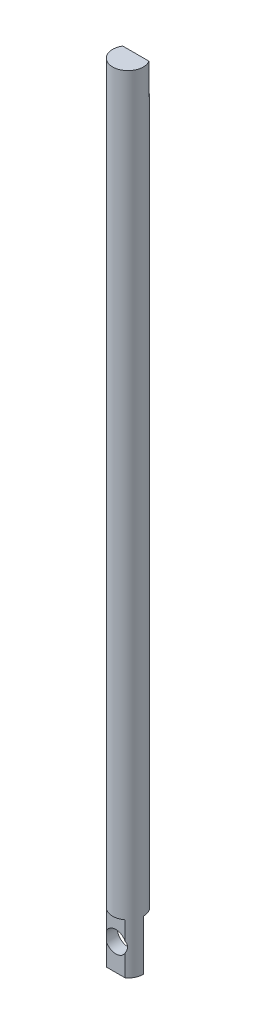
ISO-10303-21;
HEADER;
FILE_DESCRIPTION(('STEP AP214'),'2;1');
FILE_NAME('part.step','',(''),(''),'','','');
FILE_SCHEMA(('AUTOMOTIVE_DESIGN { 1 0 10303 214 1 1 1 1 }'));
ENDSEC;
DATA;
#1=APPLICATION_CONTEXT('core data for automotive mechanical design processes');
#2=APPLICATION_PROTOCOL_DEFINITION('international standard','automotive_design',2000,#1);
#3=PRODUCT_CONTEXT('',#1,'mechanical');
#4=PRODUCT('Part','Part','',(#3));
#5=PRODUCT_RELATED_PRODUCT_CATEGORY('part','',(#4));
#6=PRODUCT_DEFINITION_FORMATION('','',#4);
#7=PRODUCT_DEFINITION_CONTEXT('part definition',#1,'design');
#8=PRODUCT_DEFINITION('design','',#6,#7);
#9=PRODUCT_DEFINITION_SHAPE('','',#8);
#10=(LENGTH_UNIT() NAMED_UNIT(*) SI_UNIT(.MILLI.,.METRE.));
#11=(NAMED_UNIT(*) PLANE_ANGLE_UNIT() SI_UNIT($,.RADIAN.));
#12=(NAMED_UNIT(*) SI_UNIT($,.STERADIAN.) SOLID_ANGLE_UNIT());
#13=UNCERTAINTY_MEASURE_WITH_UNIT(LENGTH_MEASURE(1.E-05),#10,'distance_accuracy_value','');
#14=(GEOMETRIC_REPRESENTATION_CONTEXT(3) GLOBAL_UNCERTAINTY_ASSIGNED_CONTEXT((#13)) GLOBAL_UNIT_ASSIGNED_CONTEXT((#10,
#11,#12)) REPRESENTATION_CONTEXT('',''));
#15=CARTESIAN_POINT('',(0.,0.,0.));
#16=DIRECTION('',(0.,0.,1.));
#17=DIRECTION('',(1.,0.,0.));
#18=AXIS2_PLACEMENT_3D('',#15,#16,#17);
#19=CARTESIAN_POINT('',(0.,0.,0.));
#20=DIRECTION('',(0.,0.,1.));
#21=DIRECTION('',(1.,0.,0.));
#22=AXIS2_PLACEMENT_3D('',#19,#20,#21);
#23=PLANE('',#22);
#24=CARTESIAN_POINT('',(0.,45.89,0.));
#25=DIRECTION('',(0.,0.,-1.));
#26=DIRECTION('',(-1.,0.,0.));
#27=AXIS2_PLACEMENT_3D('',#24,#25,#26);
#28=CIRCLE('',#27,1.235);
#29=CARTESIAN_POINT('',(-1.235,45.89,0.));
#30=VERTEX_POINT('',#29);
#31=EDGE_CURVE('E142',#30,#30,#28,.T.);
#32=ORIENTED_EDGE('',*,*,#31,.T.);
#33=EDGE_LOOP('',(#32));
#34=FACE_BOUND('',#33,.T.);
#35=ADVANCED_FACE('F47',(#34),#23,.F.);
#36=CARTESIAN_POINT('',(0.,50.,0.));
#37=DIRECTION('',(0.,-1.,0.));
#38=DIRECTION('',(0.,0.,-1.));
#39=AXIS2_PLACEMENT_3D('',#36,#37,#38);
#40=CYLINDRICAL_SURFACE('',#39,1.95);
#41=CARTESIAN_POINT('',(0.,46.,0.));
#42=DIRECTION('',(0.,-1.,0.));
#43=DIRECTION('',(0.,0.,-1.));
#44=AXIS2_PLACEMENT_3D('',#41,#42,#43);
#45=CIRCLE('',#44,1.95);
#46=CARTESIAN_POINT('',(1.23009146001428,45.9999999999998,-1.51306807513776));
#47=VERTEX_POINT('',#46);
#48=CARTESIAN_POINT('',(1.67406690427832,46.,-1.));
#49=VERTEX_POINT('',#48);
#50=EDGE_CURVE('E127',#47,#49,#45,.T.);
#51=ORIENTED_EDGE('',*,*,#50,.T.);
#52=DIRECTION('',(0.,-1.,0.));
#53=VECTOR('',#52,1.);
#54=CARTESIAN_POINT('',(1.67406690427832,50.,-1.));
#55=LINE('',#54,#53);
#56=CARTESIAN_POINT('',(1.67406690427832,50.,-1.));
#57=VERTEX_POINT('',#56);
#58=EDGE_CURVE('E131',#57,#49,#55,.T.);
#59=ORIENTED_EDGE('',*,*,#58,.F.);
#60=CARTESIAN_POINT('',(0.,50.,0.));
#61=DIRECTION('',(0.,1.,0.));
#62=DIRECTION('',(0.,0.,1.));
#63=AXIS2_PLACEMENT_3D('',#60,#61,#62);
#64=CIRCLE('',#63,1.95);
#65=CARTESIAN_POINT('',(-1.67406690427832,50.,-1.));
#66=VERTEX_POINT('',#65);
#67=EDGE_CURVE('E63',#66,#57,#64,.T.);
#68=ORIENTED_EDGE('',*,*,#67,.F.);
#69=DIRECTION('',(0.,-1.,0.));
#70=VECTOR('',#69,1.);
#71=CARTESIAN_POINT('',(-1.67406690427832,50.,-1.));
#72=LINE('',#71,#70);
#73=CARTESIAN_POINT('',(-1.67406690427832,46.,-1.));
#74=VERTEX_POINT('',#73);
#75=EDGE_CURVE('E138',#66,#74,#72,.T.);
#76=ORIENTED_EDGE('',*,*,#75,.T.);
#77=CARTESIAN_POINT('',(-1.23009146001425,46.,-1.5130680751374));
#78=VERTEX_POINT('',#77);
#79=EDGE_CURVE('E212',#74,#78,#45,.T.);
#80=ORIENTED_EDGE('',*,*,#79,.T.);
#81=CARTESIAN_POINT('',(0.,47.125,-1.95));
#82=CARTESIAN_POINT('',(0.0626043419250775,47.1249956493,-1.94999593237426));
#83=CARTESIAN_POINT('',(0.125274360724051,47.1202079994133,-1.94695420817682));
#84=CARTESIAN_POINT('',(0.248679738064392,47.1013198780486,-1.93507598048095));
#85=CARTESIAN_POINT('',(0.309411596208038,47.0872034572559,-1.92622955291784));
#86=CARTESIAN_POINT('',(0.426920156029563,47.0504894048464,-1.90362888074615));
#87=CARTESIAN_POINT('',(0.483714779439162,47.0279336691666,-1.88989889630417));
#88=CARTESIAN_POINT('',(0.592509535123317,46.9752714999837,-1.85866632577781));
#89=CARTESIAN_POINT('',(0.644509994080675,46.9451655814844,-1.8411639970193));
#90=CARTESIAN_POINT('',(0.746998596301197,46.8755762679495,-1.80214794532135));
#91=CARTESIAN_POINT('',(0.797023766584106,46.8355311393707,-1.78042421515069));
#92=CARTESIAN_POINT('',(0.890095511196286,46.7485000570194,-1.73577096722796));
#93=CARTESIAN_POINT('',(0.933132399105897,46.7015046389015,-1.71283983318987));
#94=CARTESIAN_POINT('',(1.01713610462889,46.5942239338941,-1.66450993227699));
#95=CARTESIAN_POINT('',(1.05697216030862,46.5329992010234,-1.63921442765248));
#96=CARTESIAN_POINT('',(1.12568394782413,46.4032500715706,-1.59281470173777));
#97=CARTESIAN_POINT('',(1.15457835963664,46.3347383741181,-1.57170336672508));
#98=CARTESIAN_POINT('',(1.19388012481432,46.2107929127631,-1.54194352403434));
#99=CARTESIAN_POINT('',(1.20715811282366,46.1567096798827,-1.53147464037501));
#100=CARTESIAN_POINT('',(1.2263153884974,46.0465003689877,-1.51618129549804));
#101=CARTESIAN_POINT('',(1.23220556785545,45.9903774240786,-1.51134852581408));
#102=CARTESIAN_POINT('',(1.23623079657884,45.8774971254062,-1.50805901957853));
#103=CARTESIAN_POINT('',(1.23434354266177,45.8207384132672,-1.50962062002863));
#104=CARTESIAN_POINT('',(1.22289435366482,45.7084988929212,-1.51890739109984));
#105=CARTESIAN_POINT('',(1.21332616169414,45.6530191644924,-1.5266375866269));
#106=CARTESIAN_POINT('',(1.18743093642361,45.5462336612381,-1.54685649117226));
#107=CARTESIAN_POINT('',(1.17129052865445,45.4948561026676,-1.55921310416207));
#108=CARTESIAN_POINT('',(1.13290842112087,45.3954432720704,-1.5873194645209));
#109=CARTESIAN_POINT('',(1.11066458255473,45.3474091790927,-1.60307040093358));
#110=CARTESIAN_POINT('',(1.05584026154292,45.2463121362935,-1.6398123672228));
#111=CARTESIAN_POINT('',(1.02209780994475,45.1940348788982,-1.6612299996241));
#112=CARTESIAN_POINT('',(0.947376265657847,45.0953035648796,-1.7049506073427));
#113=CARTESIAN_POINT('',(0.906389602858913,45.0488556875706,-1.72725448969359));
#114=CARTESIAN_POINT('',(0.809925625335982,44.95483417338,-1.77479277041782));
#115=CARTESIAN_POINT('',(0.75316779296537,44.9084748298213,-1.79986054651542));
#116=CARTESIAN_POINT('',(0.63123612360164,44.8259627043625,-1.84615451175042));
#117=CARTESIAN_POINT('',(0.566065089812985,44.7898065355815,-1.86738197481426));
#118=CARTESIAN_POINT('',(0.432208649717868,44.7309094610663,-1.90269264785808));
#119=CARTESIAN_POINT('',(0.363863580902951,44.7075865332377,-1.91708084692044));
#120=CARTESIAN_POINT('',(0.223087239917364,44.6731659196428,-1.9384980732179));
#121=CARTESIAN_POINT('',(0.150662243330454,44.6620499697285,-1.94553809405432));
#122=CARTESIAN_POINT('',(0.0158409234431742,44.6535438884192,-1.95092129657185));
#123=CARTESIAN_POINT('',(-0.0464003519139827,44.6543190106383,-1.95042706886936));
#124=CARTESIAN_POINT('',(-0.169734750287587,44.6651555133259,-1.9435793022705));
#125=CARTESIAN_POINT('',(-0.230827974256584,44.6752160733545,-1.93722628104363));
#126=CARTESIAN_POINT('',(-0.347405954044288,44.7034192133504,-1.91967040710496));
#127=CARTESIAN_POINT('',(-0.40301932425298,44.7211812717647,-1.90869652505848));
#128=CARTESIAN_POINT('',(-0.510403410692578,44.7639202755412,-1.88282809023713));
#129=CARTESIAN_POINT('',(-0.562173512290872,44.7888983718132,-1.86793291207534));
#130=CARTESIAN_POINT('',(-0.665998087338009,44.8480834608682,-1.83363720870291));
#131=CARTESIAN_POINT('',(-0.717569158132857,44.8829610823708,-1.81393599673098));
#132=CARTESIAN_POINT('',(-0.814475276950027,44.9595818572676,-1.77254415250982));
#133=CARTESIAN_POINT('',(-0.859803494483645,45.0013324226555,-1.75085138379979));
#134=CARTESIAN_POINT('',(-0.949986002624826,45.0977014322979,-1.70381371835858));
#135=CARTESIAN_POINT('',(-0.993754616219873,45.1533105355772,-1.67840801659356));
#136=CARTESIAN_POINT('',(-1.07153023647413,45.2718837647279,-1.62985413696579));
#137=CARTESIAN_POINT('',(-1.10554263033081,45.3348438044229,-1.60670471790762));
#138=CARTESIAN_POINT('',(-1.15675422659756,45.453625453481,-1.57009593958291));
#139=CARTESIAN_POINT('',(-1.17597153351227,45.5082595037578,-1.55562292045947));
#140=CARTESIAN_POINT('',(-1.20668825878752,45.6207164220751,-1.53192178363557));
#141=CARTESIAN_POINT('',(-1.21820005419962,45.6785340140343,-1.52268525843679));
#142=CARTESIAN_POINT('',(-1.2328769836864,45.7963079421119,-1.5108310911645));
#143=CARTESIAN_POINT('',(-1.23598808024421,45.8562756222319,-1.50825630515207));
#144=CARTESIAN_POINT('',(-1.23346056969596,45.9759102523436,-1.51032338816183));
#145=CARTESIAN_POINT('',(-1.2278200240616,46.0355771327695,-1.51496685606033));
#146=CARTESIAN_POINT('',(-1.20912722837957,46.1471838576901,-1.52991263705544));
#147=CARTESIAN_POINT('',(-1.19680735305982,46.1993285021671,-1.53965290935643));
#148=CARTESIAN_POINT('',(-1.16590048364067,46.3007490499389,-1.56318638445163));
#149=CARTESIAN_POINT('',(-1.14731069853634,46.3500236641853,-1.57698139182968));
#150=CARTESIAN_POINT('',(-1.10144049128339,46.4517746728264,-1.60941637979477));
#151=CARTESIAN_POINT('',(-1.0733079603261,46.5037342041207,-1.6284642122801));
#152=CARTESIAN_POINT('',(-1.0103182692736,46.6026902158951,-1.66827686633009));
#153=CARTESIAN_POINT('',(-0.97545583972145,46.6496827623513,-1.68904302600338));
#154=CARTESIAN_POINT('',(-0.891507403703957,46.7475671918403,-1.73506698987154));
#155=CARTESIAN_POINT('',(-0.840971684450958,46.7972132318426,-1.76035429782563));
#156=CARTESIAN_POINT('',(-0.731437368635478,46.8876305323042,-1.80861330771987));
#157=CARTESIAN_POINT('',(-0.672432733096951,46.9283954071449,-1.83158333719107));
#158=CARTESIAN_POINT('',(-0.546073683301654,47.0001257367697,-1.87317616314501));
#159=CARTESIAN_POINT('',(-0.478612677889542,47.0309439480103,-1.89173265566962));
#160=CARTESIAN_POINT('',(-0.337957049691609,47.0801746962668,-1.92182397367313));
#161=CARTESIAN_POINT('',(-0.26478308334979,47.0986298086417,-1.93338288365507));
#162=CARTESIAN_POINT('',(-0.158876027022065,47.1151529769409,-1.9437758385193));
#163=CARTESIAN_POINT('',(-0.127266090687898,47.1188380609689,-1.94610244753047));
#164=CARTESIAN_POINT('',(-0.0637764623097281,47.1237627477024,-1.94921560660432));
#165=CARTESIAN_POINT('',(-0.0318967556092168,47.1250022166708,-1.95000207244514));
#166=CARTESIAN_POINT('',(0.,47.125,-1.95));
#167=B_SPLINE_CURVE_WITH_KNOTS('',3,(#81,#82,#83,#84,#85,#86,#87,#88,#89,#90,#91,#92,#93,#94,
#95,#96,#97,#98,#99,#100,#101,#102,#103,#104,#105,#106,#107,#108,#109,#110,#111,#112,#113,#114,
#115,#116,#117,#118,#119,#120,#121,#122,#123,#124,#125,#126,#127,#128,#129,#130,#131,#132,#133,
#134,#135,#136,#137,#138,#139,#140,#141,#142,#143,#144,#145,#146,#147,#148,#149,#150,#151,#152,
#153,#154,#155,#156,#157,#158,#159,#160,#161,#162,#163,#164,#165,#166),.UNSPECIFIED.,.T.,.F.,(4,
2,2,2,2,2,2,2,2,2,2,2,2,2,2,2,2,2,2,2,2,2,2,2,2,2,2,2,2,2,2,2,2,2,2,2,2,2,2,2,2,2,4),(0.,
0.187679869050647,0.375681445696825,0.562761834931024,0.749829466741541,0.952036400798287,
1.15452126343981,1.38531711981071,1.61571715727658,1.7850121327306,1.95405722560252,
2.12358742455594,2.29325586308704,2.45840948045397,2.62362104604203,2.82031189204719,
3.01720950603595,3.24841858332346,3.47955082166404,3.69908752237275,3.91829530161702,
4.10407231714036,4.28983291940685,4.46730753548373,4.6448104732197,4.83996007566668,
5.03532152897027,5.25991357583931,5.4843813674965,5.66277271859545,5.84087683482312,
6.02012390721964,6.19941068932154,6.36214461482359,6.52495107597139,6.71054014149039,
6.89627511553562,7.12092438280677,7.34573464523024,7.57373458601926,7.80094526048842,
7.89656245567087,7.99218487948043),.UNSPECIFIED.);
#168=EDGE_CURVE('E154',#47,#78,#167,.T.);
#169=ORIENTED_EDGE('',*,*,#168,.F.);
#170=EDGE_LOOP('',(#51,#59,#68,#76,#80,#169));
#171=FACE_BOUND('',#170,.T.);
#172=DIRECTION('',(0.,-1.,0.));
#173=VECTOR('',#172,1.);
#174=CARTESIAN_POINT('',(-1.18321595661992,50.,1.55));
#175=LINE('',#174,#173);
#176=CARTESIAN_POINT('',(-1.18321595661992,-50.,1.55));
#177=VERTEX_POINT('',#176);
#178=CARTESIAN_POINT('',(-1.18321595661992,-47.25,1.55));
#179=VERTEX_POINT('',#178);
#180=EDGE_CURVE('E190',#177,#179,#175,.F.);
#181=ORIENTED_EDGE('',*,*,#180,.T.);
#182=CARTESIAN_POINT('',(0.,-47.95,1.95));
#183=CARTESIAN_POINT('',(-0.0672886072571552,-47.9500012565197,1.95000112082033));
#184=CARTESIAN_POINT('',(-0.134571545462228,-47.9449416502136,1.94648794721811));
#185=CARTESIAN_POINT('',(-0.266975271348622,-47.9250321618644,1.93278520096084));
#186=CARTESIAN_POINT('',(-0.332095118241062,-47.9101780770059,1.92259276224151));
#187=CARTESIAN_POINT('',(-0.458052097685245,-47.8716173114735,1.89652590773088));
#188=CARTESIAN_POINT('',(-0.518908316469456,-47.8479535382192,1.88067904699031));
#189=CARTESIAN_POINT('',(-0.635503241329199,-47.792811496891,1.84455033610952));
#190=CARTESIAN_POINT('',(-0.691241233501077,-47.7613321409404,1.82426786860941));
#191=CARTESIAN_POINT('',(-0.801537503471792,-47.6884773755134,1.77873596362046));
#192=CARTESIAN_POINT('',(-0.855564938294247,-47.646476724841,1.75320709076829));
#193=CARTESIAN_POINT('',(-0.956297490815979,-47.5553111152085,1.70036418534288));
#194=CARTESIAN_POINT('',(-1.00299152755692,-47.5061355269324,1.67304753796731));
#195=CARTESIAN_POINT('',(-1.09595684499621,-47.3922618586947,1.61397071070636));
#196=CARTESIAN_POINT('',(-1.14077692742408,-47.3263484759463,1.58225350432699));
#197=CARTESIAN_POINT('',(-1.21871009450242,-47.1862143089948,1.52303569264858));
#198=CARTESIAN_POINT('',(-1.25184301557486,-47.1120078851634,1.495527988013));
#199=CARTESIAN_POINT('',(-1.29661604582403,-46.9801770180345,1.45666865857674));
#200=CARTESIAN_POINT('',(-1.31173102257022,-46.9244389232225,1.44294927269372));
#201=CARTESIAN_POINT('',(-1.33476706293009,-46.8103955627404,1.42167074810647));
#202=CARTESIAN_POINT('',(-1.34270178184195,-46.7520953920439,1.41409991900109));
#203=CARTESIAN_POINT('',(-1.35086834088841,-46.6341304117136,1.40630431589744));
#204=CARTESIAN_POINT('',(-1.35105916037661,-46.5744600097825,1.40611866243207));
#205=CARTESIAN_POINT('',(-1.34361563295359,-46.4560473206184,1.41323015466256));
#206=CARTESIAN_POINT('',(-1.33597575932257,-46.3973057186423,1.42053258527435));
#207=CARTESIAN_POINT('',(-1.31411493779154,-46.2859439522232,1.44076452508759));
#208=CARTESIAN_POINT('',(-1.30032093865164,-46.2331685595233,1.45332614738785));
#209=CARTESIAN_POINT('',(-1.26694210319872,-46.1306732731662,1.48251453027835));
#210=CARTESIAN_POINT('',(-1.24735269250636,-46.0809558307665,1.49914450025682));
#211=CARTESIAN_POINT('',(-1.19148068871854,-45.9602362974471,1.54425821381297));
#212=CARTESIAN_POINT('',(-1.1517940245156,-45.8914357998517,1.57444003815845));
#213=CARTESIAN_POINT('',(-1.06154023126315,-45.7622293345884,1.63665814052057));
#214=CARTESIAN_POINT('',(-1.01095170520499,-45.7018402653124,1.66869797353137));
#215=CARTESIAN_POINT('',(-0.899003034057058,-45.589738010357,1.73160692647304));
#216=CARTESIAN_POINT('',(-0.837534971513948,-45.5381229818723,1.76246014686641));
#217=CARTESIAN_POINT('',(-0.705010497249166,-45.4459001280234,1.81951606236285));
#218=CARTESIAN_POINT('',(-0.633974438656167,-45.4052694737636,1.84572836295027));
#219=CARTESIAN_POINT('',(-0.500419467838252,-45.3445297254675,1.88568541026081));
#220=CARTESIAN_POINT('',(-0.439502338761321,-45.3218681927684,1.90090580230215));
#221=CARTESIAN_POINT('',(-0.313957963989147,-45.2853924095293,1.92561972190675));
#222=CARTESIAN_POINT('',(-0.249333272920252,-45.2715721449972,1.93511714208408));
#223=CARTESIAN_POINT('',(-0.117868628848553,-45.2535142468478,1.94755755547201));
#224=CARTESIAN_POINT('',(-0.0510212535096684,-45.2493128762231,1.9504757445157));
#225=CARTESIAN_POINT('',(0.0825027180580811,-45.2508706638287,1.94939719154462));
#226=CARTESIAN_POINT('',(0.149179315267095,-45.2566297647638,1.94540048930605));
#227=CARTESIAN_POINT('',(0.276257494834567,-45.2770958909907,1.93132731170817));
#228=CARTESIAN_POINT('',(0.336794720041903,-45.2912407966121,1.92163308093252));
#229=CARTESIAN_POINT('',(0.454432674795627,-45.32729465572,1.8972619439447));
#230=CARTESIAN_POINT('',(0.511532764716368,-45.3492050491135,1.88258411367531));
#231=CARTESIAN_POINT('',(0.625408279963362,-45.4018388804371,1.84801686363602));
#232=CARTESIAN_POINT('',(0.681840184036858,-45.4330987941144,1.82781982199462));
#233=CARTESIAN_POINT('',(0.788865771652202,-45.5026079387441,1.78424662256167));
#234=CARTESIAN_POINT('',(0.839455442897493,-45.5408619270176,1.76086830367219));
#235=CARTESIAN_POINT('',(0.942428000712018,-45.6305901243704,1.70827744914585));
#236=CARTESIAN_POINT('',(0.993654747553963,-45.6832062158964,1.67874858534955));
#237=CARTESIAN_POINT('',(1.08702830553904,-45.7961084445219,1.61985081919826));
#238=CARTESIAN_POINT('',(1.12916913824487,-45.8563995904912,1.59048203448432));
#239=CARTESIAN_POINT('',(1.19935778000668,-45.9768401148281,1.53809436663438));
#240=CARTESIAN_POINT('',(1.22846526936238,-46.0362198676079,1.51473332928469));
#241=CARTESIAN_POINT('',(1.27806349677669,-46.1601299880406,1.47312769918897));
#242=CARTESIAN_POINT('',(1.29857116732994,-46.2246499339074,1.45487307607142));
#243=CARTESIAN_POINT('',(1.32691356049556,-46.3452749421314,1.4290207738276));
#244=CARTESIAN_POINT('',(1.33640234471863,-46.4006931300055,1.42006755653593));
#245=CARTESIAN_POINT('',(1.34836655527024,-46.5129225620229,1.40871591739609));
#246=CARTESIAN_POINT('',(1.35084995191699,-46.5697321487938,1.40631004647213));
#247=CARTESIAN_POINT('',(1.3486330998875,-46.6831001779565,1.40843527981993));
#248=CARTESIAN_POINT('',(1.34392939500912,-46.7396584863918,1.41296972161745));
#249=CARTESIAN_POINT('',(1.32766746751545,-46.8509439084582,1.42825715934052));
#250=CARTESIAN_POINT('',(1.31609932957481,-46.9056682519782,1.4390191500853));
#251=CARTESIAN_POINT('',(1.28234076045489,-47.0280768332446,1.4692691753036));
#252=CARTESIAN_POINT('',(1.25801078768572,-47.0947560062162,1.49040272773153));
#253=CARTESIAN_POINT('',(1.20013511541175,-47.2221677927867,1.53738833329745));
#254=CARTESIAN_POINT('',(1.16657527269804,-47.2828910846987,1.56324760723047));
#255=CARTESIAN_POINT('',(1.09024664929298,-47.3992550108179,1.61743721715107));
#256=CARTESIAN_POINT('',(1.04728752462723,-47.4547504094869,1.64581008327935));
#257=CARTESIAN_POINT('',(0.953157490399776,-47.5585944949287,1.70205785679877));
#258=CARTESIAN_POINT('',(0.901983896496414,-47.6069408355612,1.72993259809114));
#259=CARTESIAN_POINT('',(0.782958024854612,-47.70282208573,1.78732012674527));
#260=CARTESIAN_POINT('',(0.713746930330097,-47.7489715439461,1.81637337012162));
#261=CARTESIAN_POINT('',(0.566040172293907,-47.8284524977788,1.86766586312536));
#262=CARTESIAN_POINT('',(0.487559372873464,-47.8618041594954,1.88991582167907));
#263=CARTESIAN_POINT('',(0.340996905710895,-47.907985141652,1.92109436989584));
#264=CARTESIAN_POINT('',(0.274195499361429,-47.9236542325232,1.93183976524997));
#265=CARTESIAN_POINT('',(0.138259274559093,-47.9446562968359,1.94628878936396));
#266=CARTESIAN_POINT('',(0.0691266457841349,-47.9499987091575,1.94999884856363));
#267=CARTESIAN_POINT('',(0.,-47.95,1.95));
#268=B_SPLINE_CURVE_WITH_KNOTS('',3,(#182,#183,#184,#185,#186,#187,#188,#189,#190,#191,#192,
#193,#194,#195,#196,#197,#198,#199,#200,#201,#202,#203,#204,#205,#206,#207,#208,#209,#210,#211,
#212,#213,#214,#215,#216,#217,#218,#219,#220,#221,#222,#223,#224,#225,#226,#227,#228,#229,#230,
#231,#232,#233,#234,#235,#236,#237,#238,#239,#240,#241,#242,#243,#244,#245,#246,#247,#248,#249,
#250,#251,#252,#253,#254,#255,#256,#257,#258,#259,#260,#261,#262,#263,#264,#265,#266,#267),
.UNSPECIFIED.,.T.,.F.,(4,2,2,2,2,2,2,2,2,2,2,2,2,2,2,2,2,2,2,2,2,2,2,2,2,2,2,2,2,2,2,2,2,2,2,2,
2,2,2,2,2,2,4),(0.,0.2015860976583,0.403258752348129,0.603961747895663,0.804692695634186,
1.02300363960517,1.24164134761819,1.49784609988198,1.75361388370314,1.93101001887644,
2.10806807156935,2.2860639067125,2.4641854537078,2.63151095356372,2.798968879176,
3.05253808176948,3.30660957072642,3.56335909226615,3.81957083432546,4.01899661389147,
4.21828659575591,4.41832666743233,4.61836558843119,4.80630857410946,4.99428642715636,
5.19631991463724,5.39849133863379,5.63501805589087,5.87169993350499,6.08136107739267,
6.29060745128611,6.46066809993245,6.63053518537902,6.80048398384734,6.97067886434808,
7.19165559070069,7.41297283130848,7.639273520276,7.86564831137441,8.12849190229262,
8.39091960033948,8.59820172426004,8.80529429662637),.UNSPECIFIED.);
#269=CARTESIAN_POINT('',(-1.18321595662271,-45.9500000000004,1.54999999999788));
#270=VERTEX_POINT('',#269);
#271=EDGE_CURVE('E71',#179,#270,#268,.T.);
#272=ORIENTED_EDGE('',*,*,#271,.T.);
#273=CARTESIAN_POINT('',(-1.18321595661992,-43.6,1.55));
#274=VERTEX_POINT('',#273);
#275=EDGE_CURVE('E189',#270,#274,#175,.F.);
#276=ORIENTED_EDGE('',*,*,#275,.T.);
#277=CARTESIAN_POINT('',(0.,-43.6,0.));
#278=DIRECTION('',(0.,1.,0.));
#279=DIRECTION('',(0.,0.,1.));
#280=AXIS2_PLACEMENT_3D('',#277,#278,#279);
#281=CIRCLE('',#280,1.95);
#282=CARTESIAN_POINT('',(1.18321595661992,-43.6,1.55));
#283=VERTEX_POINT('',#282);
#284=EDGE_CURVE('E219',#274,#283,#281,.T.);
#285=ORIENTED_EDGE('',*,*,#284,.T.);
#286=DIRECTION('',(0.,-1.,0.));
#287=VECTOR('',#286,1.);
#288=CARTESIAN_POINT('',(1.18321595661992,50.,1.55));
#289=LINE('',#288,#287);
#290=CARTESIAN_POINT('',(1.18321595661992,-45.95,1.55));
#291=VERTEX_POINT('',#290);
#292=EDGE_CURVE('E194',#283,#291,#289,.T.);
#293=ORIENTED_EDGE('',*,*,#292,.T.);
#294=CARTESIAN_POINT('',(1.18321595661992,-47.25,1.55));
#295=VERTEX_POINT('',#294);
#296=EDGE_CURVE('E177',#291,#295,#268,.T.);
#297=ORIENTED_EDGE('',*,*,#296,.T.);
#298=CARTESIAN_POINT('',(1.18321595661992,-50.,1.55));
#299=VERTEX_POINT('',#298);
#300=EDGE_CURVE('E193',#295,#299,#289,.T.);
#301=ORIENTED_EDGE('',*,*,#300,.T.);
#302=CARTESIAN_POINT('',(0.,-50.,0.));
#303=DIRECTION('',(0.,1.,0.));
#304=DIRECTION('',(0.,0.,1.));
#305=AXIS2_PLACEMENT_3D('',#302,#303,#304);
#306=CIRCLE('',#305,1.95);
#307=CARTESIAN_POINT('',(1.95,-50.,0.));
#308=VERTEX_POINT('',#307);
#309=EDGE_CURVE('E208',#299,#308,#306,.T.);
#310=ORIENTED_EDGE('',*,*,#309,.T.);
#311=DIRECTION('',(0.,1.,0.));
#312=VECTOR('',#311,1.);
#313=CARTESIAN_POINT('',(1.95,-50.,0.));
#314=LINE('',#313,#312);
#315=CARTESIAN_POINT('',(1.95,-43.6,0.));
#316=VERTEX_POINT('',#315);
#317=EDGE_CURVE('E203',#308,#316,#314,.T.);
#318=ORIENTED_EDGE('',*,*,#317,.T.);
#319=CARTESIAN_POINT('',(0.,-43.6,0.));
#320=DIRECTION('',(0.,1.,0.));
#321=DIRECTION('',(0.,0.,1.));
#322=AXIS2_PLACEMENT_3D('',#319,#320,#321);
#323=CIRCLE('',#322,1.95);
#324=CARTESIAN_POINT('',(-1.95,-43.6,0.));
#325=VERTEX_POINT('',#324);
#326=EDGE_CURVE('E214',#316,#325,#323,.T.);
#327=ORIENTED_EDGE('',*,*,#326,.T.);
#328=DIRECTION('',(0.,-1.,0.));
#329=VECTOR('',#328,1.);
#330=CARTESIAN_POINT('',(-1.95,-50.,0.));
#331=LINE('',#330,#329);
#332=CARTESIAN_POINT('',(-1.95,-50.,0.));
#333=VERTEX_POINT('',#332);
#334=EDGE_CURVE('E197',#325,#333,#331,.T.);
#335=ORIENTED_EDGE('',*,*,#334,.T.);
#336=EDGE_CURVE('E128',#333,#177,#306,.T.);
#337=ORIENTED_EDGE('',*,*,#336,.T.);
#338=EDGE_LOOP('',(#181,#272,#276,#285,#293,#297,#301,#310,#318,#327,#335,#337));
#339=FACE_BOUND('',#338,.T.);
#340=ADVANCED_FACE('F49',(#171,#339),#40,.T.);
#341=CARTESIAN_POINT('',(-1.95,46.,-1.95));
#342=DIRECTION('',(0.,-1.,0.));
#343=DIRECTION('',(0.,0.,-1.));
#344=AXIS2_PLACEMENT_3D('',#341,#342,#343);
#345=PLANE('',#344);
#346=DIRECTION('',(0.,0.,1.));
#347=VECTOR('',#346,1.);
#348=CARTESIAN_POINT('',(1.23009146001425,46.,-1.95));
#349=LINE('',#348,#347);
#350=CARTESIAN_POINT('',(1.23009146001425,46.,-1.));
#351=VERTEX_POINT('',#350);
#352=EDGE_CURVE('E161',#351,#47,#349,.F.);
#353=ORIENTED_EDGE('',*,*,#352,.F.);
#354=DIRECTION('',(-1.,0.,0.));
#355=VECTOR('',#354,1.);
#356=CARTESIAN_POINT('',(1.95,46.,-1.));
#357=LINE('',#356,#355);
#358=EDGE_CURVE('E137',#49,#351,#357,.T.);
#359=ORIENTED_EDGE('',*,*,#358,.F.);
#360=ORIENTED_EDGE('',*,*,#50,.F.);
#361=EDGE_LOOP('',(#353,#359,#360));
#362=FACE_BOUND('',#361,.T.);
#363=ADVANCED_FACE('F253',(#362),#345,.F.);
#364=ORIENTED_EDGE('',*,*,#79,.F.);
#365=DIRECTION('',(-1.,0.,0.));
#366=VECTOR('',#365,1.);
#367=CARTESIAN_POINT('',(-1.23009146001425,46.,-1.));
#368=LINE('',#367,#366);
#369=CARTESIAN_POINT('',(-1.23009146001425,46.,-1.));
#370=VERTEX_POINT('',#369);
#371=EDGE_CURVE('E143',#370,#74,#368,.T.);
#372=ORIENTED_EDGE('',*,*,#371,.F.);
#373=DIRECTION('',(0.,0.,1.));
#374=VECTOR('',#373,1.);
#375=CARTESIAN_POINT('',(-1.23009146001425,46.,-1.95));
#376=LINE('',#375,#374);
#377=EDGE_CURVE('E146',#78,#370,#376,.T.);
#378=ORIENTED_EDGE('',*,*,#377,.F.);
#379=EDGE_LOOP('',(#364,#372,#378));
#380=FACE_BOUND('',#379,.T.);
#381=ADVANCED_FACE('F259',(#380),#345,.F.);
#382=CARTESIAN_POINT('',(-1.95,-43.6,1.55));
#383=DIRECTION('',(0.,0.,-1.));
#384=DIRECTION('',(-1.,0.,0.));
#385=AXIS2_PLACEMENT_3D('',#382,#383,#384);
#386=PLANE('',#385);
#387=ORIENTED_EDGE('',*,*,#275,.F.);
#388=CARTESIAN_POINT('',(0.,-46.6,1.55));
#389=DIRECTION('',(0.,0.,-1.));
#390=DIRECTION('',(-1.,0.,0.));
#391=AXIS2_PLACEMENT_3D('',#388,#389,#390);
#392=CIRCLE('',#391,1.34999999999999);
#393=EDGE_CURVE('E11',#270,#291,#392,.T.);
#394=ORIENTED_EDGE('',*,*,#393,.T.);
#395=ORIENTED_EDGE('',*,*,#292,.F.);
#396=DIRECTION('',(1.,0.,0.));
#397=VECTOR('',#396,1.);
#398=CARTESIAN_POINT('',(-1.95,-43.6,1.55));
#399=LINE('',#398,#397);
#400=EDGE_CURVE('E186',#274,#283,#399,.T.);
#401=ORIENTED_EDGE('',*,*,#400,.F.);
#402=EDGE_LOOP('',(#387,#394,#395,#401));
#403=FACE_BOUND('',#402,.T.);
#404=ADVANCED_FACE('F255',(#403),#386,.F.);
#405=CARTESIAN_POINT('',(0.,-50.,0.));
#406=DIRECTION('',(0.,1.,0.));
#407=DIRECTION('',(0.,0.,1.));
#408=AXIS2_PLACEMENT_3D('',#405,#406,#407);
#409=PLANE('',#408);
#410=ORIENTED_EDGE('',*,*,#309,.F.);
#411=DIRECTION('',(-1.,0.,0.));
#412=VECTOR('',#411,1.);
#413=CARTESIAN_POINT('',(0.,-50.,1.55));
#414=LINE('',#413,#412);
#415=EDGE_CURVE('E217',#299,#177,#414,.T.);
#416=ORIENTED_EDGE('',*,*,#415,.T.);
#417=ORIENTED_EDGE('',*,*,#336,.F.);
#418=DIRECTION('',(1.,0.,0.));
#419=VECTOR('',#418,1.);
#420=CARTESIAN_POINT('',(-1.95,-50.,0.));
#421=LINE('',#420,#419);
#422=EDGE_CURVE('E200',#333,#308,#421,.T.);
#423=ORIENTED_EDGE('',*,*,#422,.T.);
#424=EDGE_LOOP('',(#410,#416,#417,#423));
#425=FACE_BOUND('',#424,.T.);
#426=ADVANCED_FACE('F229',(#425),#409,.F.);
#427=CARTESIAN_POINT('',(0.,50.,0.));
#428=DIRECTION('',(0.,1.,0.));
#429=DIRECTION('',(0.,0.,1.));
#430=AXIS2_PLACEMENT_3D('',#427,#428,#429);
#431=PLANE('',#430);
#432=ORIENTED_EDGE('',*,*,#67,.T.);
#433=DIRECTION('',(1.,0.,0.));
#434=VECTOR('',#433,1.);
#435=CARTESIAN_POINT('',(-1.95,50.,-1.));
#436=LINE('',#435,#434);
#437=EDGE_CURVE('E126',#66,#57,#436,.T.);
#438=ORIENTED_EDGE('',*,*,#437,.F.);
#439=EDGE_LOOP('',(#432,#438));
#440=FACE_BOUND('',#439,.T.);
#441=ADVANCED_FACE('F124',(#440),#431,.T.);
#442=CARTESIAN_POINT('',(-1.95,-43.6,-1.95));
#443=DIRECTION('',(0.,1.,0.));
#444=DIRECTION('',(0.,0.,1.));
#445=AXIS2_PLACEMENT_3D('',#442,#443,#444);
#446=PLANE('',#445);
#447=DIRECTION('',(-1.,0.,0.));
#448=VECTOR('',#447,1.);
#449=CARTESIAN_POINT('',(-1.95,-43.6,0.));
#450=LINE('',#449,#448);
#451=EDGE_CURVE('E206',#316,#325,#450,.T.);
#452=ORIENTED_EDGE('',*,*,#451,.T.);
#453=ORIENTED_EDGE('',*,*,#326,.F.);
#454=EDGE_LOOP('',(#452,#453));
#455=FACE_BOUND('',#454,.T.);
#456=ADVANCED_FACE('F235',(#455),#446,.F.);
#457=CARTESIAN_POINT('',(0.,0.,0.));
#458=DIRECTION('',(0.,0.,-1.));
#459=DIRECTION('',(-1.,0.,0.));
#460=AXIS2_PLACEMENT_3D('',#457,#458,#459);
#461=PLANE('',#460);
#462=CARTESIAN_POINT('',(0.,-46.6,0.));
#463=DIRECTION('',(0.,0.,-1.));
#464=DIRECTION('',(-1.,0.,0.));
#465=AXIS2_PLACEMENT_3D('',#462,#463,#464);
#466=CIRCLE('',#465,1.34999999999999);
#467=CARTESIAN_POINT('',(-1.34999999999999,-46.6,0.));
#468=VERTEX_POINT('',#467);
#469=EDGE_CURVE('E183',#468,#468,#466,.T.);
#470=ORIENTED_EDGE('',*,*,#469,.F.);
#471=EDGE_LOOP('',(#470));
#472=FACE_BOUND('',#471,.T.);
#473=ORIENTED_EDGE('',*,*,#334,.F.);
#474=ORIENTED_EDGE('',*,*,#451,.F.);
#475=ORIENTED_EDGE('',*,*,#317,.F.);
#476=ORIENTED_EDGE('',*,*,#422,.F.);
#477=EDGE_LOOP('',(#473,#474,#475,#476));
#478=FACE_BOUND('',#477,.T.);
#479=ADVANCED_FACE('F233',(#472,#478),#461,.T.);
#480=CARTESIAN_POINT('',(-1.95,-43.6,1.95));
#481=DIRECTION('',(0.,1.,0.));
#482=DIRECTION('',(0.,0.,1.));
#483=AXIS2_PLACEMENT_3D('',#480,#481,#482);
#484=PLANE('',#483);
#485=ORIENTED_EDGE('',*,*,#284,.F.);
#486=ORIENTED_EDGE('',*,*,#400,.T.);
#487=EDGE_LOOP('',(#485,#486));
#488=FACE_BOUND('',#487,.T.);
#489=ADVANCED_FACE('F175',(#488),#484,.F.);
#490=ORIENTED_EDGE('',*,*,#300,.F.);
#491=EDGE_CURVE('E52',#295,#179,#392,.T.);
#492=ORIENTED_EDGE('',*,*,#491,.T.);
#493=ORIENTED_EDGE('',*,*,#180,.F.);
#494=ORIENTED_EDGE('',*,*,#415,.F.);
#495=EDGE_LOOP('',(#490,#492,#493,#494));
#496=FACE_BOUND('',#495,.T.);
#497=ADVANCED_FACE('F173',(#496),#386,.F.);
#498=CARTESIAN_POINT('',(0.,-46.6,1.95));
#499=DIRECTION('',(0.,0.,-1.));
#500=DIRECTION('',(-1.,0.,0.));
#501=AXIS2_PLACEMENT_3D('',#498,#499,#500);
#502=CYLINDRICAL_SURFACE('',#501,1.34999999999999);
#503=ORIENTED_EDGE('',*,*,#469,.T.);
#504=EDGE_LOOP('',(#503));
#505=FACE_BOUND('',#504,.T.);
#506=ORIENTED_EDGE('',*,*,#271,.F.);
#507=ORIENTED_EDGE('',*,*,#491,.F.);
#508=ORIENTED_EDGE('',*,*,#296,.F.);
#509=ORIENTED_EDGE('',*,*,#393,.F.);
#510=EDGE_LOOP('',(#506,#507,#508,#509));
#511=FACE_BOUND('',#510,.T.);
#512=ADVANCED_FACE('F168',(#505,#511),#502,.F.);
#513=CARTESIAN_POINT('',(0.,45.89,-1.95));
#514=DIRECTION('',(0.,0.,1.));
#515=DIRECTION('',(1.,0.,0.));
#516=AXIS2_PLACEMENT_3D('',#513,#514,#515);
#517=CYLINDRICAL_SURFACE('',#516,1.235);
#518=CARTESIAN_POINT('',(0.,45.89,-1.));
#519=DIRECTION('',(0.,0.,1.));
#520=DIRECTION('',(-1.,0.,0.));
#521=AXIS2_PLACEMENT_3D('',#518,#519,#520);
#522=CIRCLE('',#521,1.235);
#523=EDGE_CURVE('E148',#351,#370,#522,.T.);
#524=ORIENTED_EDGE('',*,*,#523,.F.);
#525=ORIENTED_EDGE('',*,*,#352,.T.);
#526=ORIENTED_EDGE('',*,*,#168,.T.);
#527=ORIENTED_EDGE('',*,*,#377,.T.);
#528=EDGE_LOOP('',(#524,#525,#526,#527));
#529=FACE_BOUND('',#528,.T.);
#530=ORIENTED_EDGE('',*,*,#31,.F.);
#531=EDGE_LOOP('',(#530));
#532=FACE_BOUND('',#531,.T.);
#533=ADVANCED_FACE('F163',(#529,#532),#517,.F.);
#534=CARTESIAN_POINT('',(0.,45.89,-1.));
#535=DIRECTION('',(0.,0.,-1.));
#536=DIRECTION('',(-1.,0.,0.));
#537=AXIS2_PLACEMENT_3D('',#534,#535,#536);
#538=PLANE('',#537);
#539=ORIENTED_EDGE('',*,*,#58,.T.);
#540=ORIENTED_EDGE('',*,*,#358,.T.);
#541=ORIENTED_EDGE('',*,*,#523,.T.);
#542=ORIENTED_EDGE('',*,*,#371,.T.);
#543=ORIENTED_EDGE('',*,*,#75,.F.);
#544=ORIENTED_EDGE('',*,*,#437,.T.);
#545=EDGE_LOOP('',(#539,#540,#541,#542,#543,#544));
#546=FACE_BOUND('',#545,.T.);
#547=ADVANCED_FACE('F140',(#546),#538,.T.);
#548=CLOSED_SHELL('',(#35,#340,#363,#381,#404,#426,#441,#456,#479,#489,#497,#512,#533,#547));
#549=MANIFOLD_SOLID_BREP('B2',#548);
#550=ADVANCED_BREP_SHAPE_REPRESENTATION('',(#18,#549),#14);
#551=SHAPE_DEFINITION_REPRESENTATION(#9,#550);
ENDSEC;
END-ISO-10303-21;
